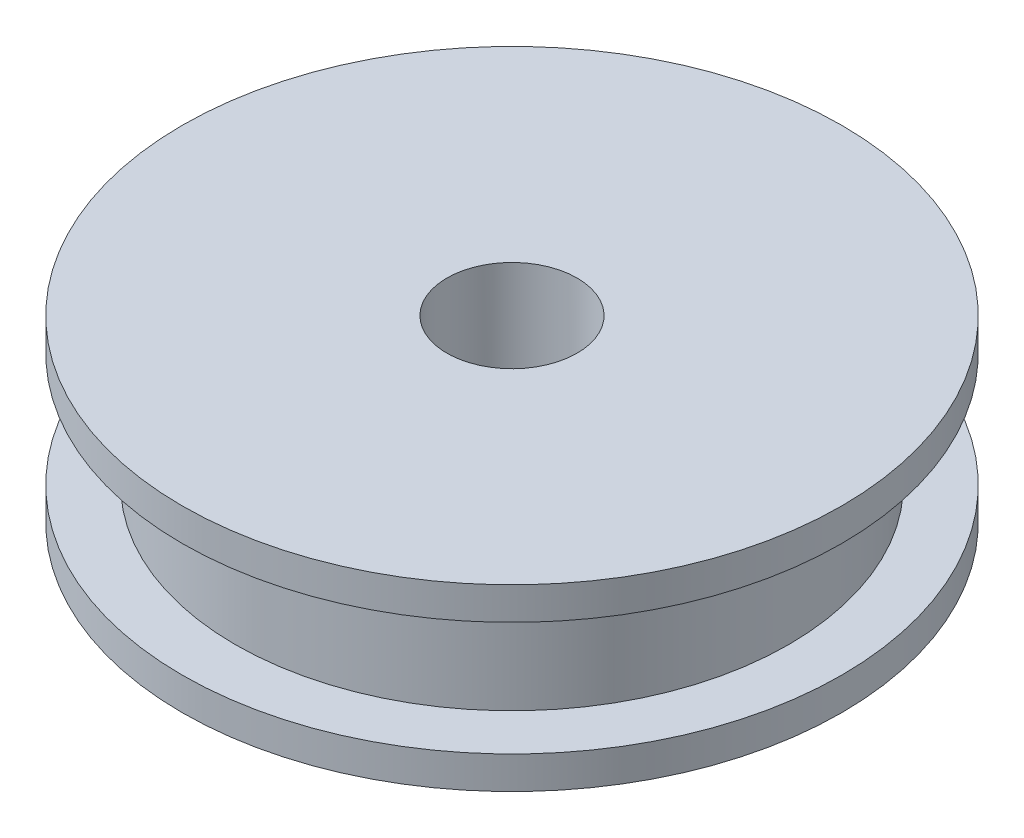
ISO-10303-21;
HEADER;
FILE_DESCRIPTION(('STEP AP214'),'2;1');
FILE_NAME('part.step','',(''),(''),'','','');
FILE_SCHEMA(('AUTOMOTIVE_DESIGN { 1 0 10303 214 1 1 1 1 }'));
ENDSEC;
DATA;
#1=APPLICATION_CONTEXT('core data for automotive mechanical design processes');
#2=APPLICATION_PROTOCOL_DEFINITION('international standard','automotive_design',2000,#1);
#3=PRODUCT_CONTEXT('',#1,'mechanical');
#4=PRODUCT('Part','Part','',(#3));
#5=PRODUCT_RELATED_PRODUCT_CATEGORY('part','',(#4));
#6=PRODUCT_DEFINITION_FORMATION('','',#4);
#7=PRODUCT_DEFINITION_CONTEXT('part definition',#1,'design');
#8=PRODUCT_DEFINITION('design','',#6,#7);
#9=PRODUCT_DEFINITION_SHAPE('','',#8);
#10=(LENGTH_UNIT() NAMED_UNIT(*) SI_UNIT(.MILLI.,.METRE.));
#11=(NAMED_UNIT(*) PLANE_ANGLE_UNIT() SI_UNIT($,.RADIAN.));
#12=(NAMED_UNIT(*) SI_UNIT($,.STERADIAN.) SOLID_ANGLE_UNIT());
#13=UNCERTAINTY_MEASURE_WITH_UNIT(LENGTH_MEASURE(1.E-05),#10,'distance_accuracy_value','');
#14=(GEOMETRIC_REPRESENTATION_CONTEXT(3) GLOBAL_UNCERTAINTY_ASSIGNED_CONTEXT((#13)) GLOBAL_UNIT_ASSIGNED_CONTEXT((#10,
#11,#12)) REPRESENTATION_CONTEXT('',''));
#15=CARTESIAN_POINT('',(0.,0.,0.));
#16=DIRECTION('',(0.,0.,1.));
#17=DIRECTION('',(1.,0.,0.));
#18=AXIS2_PLACEMENT_3D('',#15,#16,#17);
#19=CARTESIAN_POINT('',(-10.,0.,0.));
#20=DIRECTION('',(0.,1.,0.));
#21=DIRECTION('',(0.,0.,1.));
#22=AXIS2_PLACEMENT_3D('',#19,#20,#21);
#23=PLANE('',#22);
#24=CARTESIAN_POINT('',(0.,0.,0.));
#25=DIRECTION('',(0.,-1.,0.));
#26=DIRECTION('',(0.,0.,-1.));
#27=AXIS2_PLACEMENT_3D('',#24,#25,#26);
#28=CIRCLE('',#27,4.);
#29=CARTESIAN_POINT('',(0.,0.,-4.));
#30=VERTEX_POINT('',#29);
#31=EDGE_CURVE('E10',#30,#30,#28,.T.);
#32=ORIENTED_EDGE('',*,*,#31,.F.);
#33=EDGE_LOOP('',(#32));
#34=FACE_BOUND('',#33,.T.);
#35=CARTESIAN_POINT('',(0.,0.,0.));
#36=DIRECTION('',(0.,-1.,0.));
#37=DIRECTION('',(0.,0.,-1.));
#38=AXIS2_PLACEMENT_3D('',#35,#36,#37);
#39=CIRCLE('',#38,10.);
#40=CARTESIAN_POINT('',(0.,0.,-10.));
#41=VERTEX_POINT('',#40);
#42=EDGE_CURVE('E91',#41,#41,#39,.T.);
#43=ORIENTED_EDGE('',*,*,#42,.T.);
#44=EDGE_LOOP('',(#43));
#45=FACE_BOUND('',#44,.T.);
#46=ADVANCED_FACE('F42',(#34,#45),#23,.F.);
#47=CARTESIAN_POINT('',(0.,0.,0.));
#48=DIRECTION('',(0.,-1.,0.));
#49=DIRECTION('',(0.,0.,-1.));
#50=AXIS2_PLACEMENT_3D('',#47,#48,#49);
#51=CYLINDRICAL_SURFACE('',#50,4.);
#52=CARTESIAN_POINT('',(-3.46410161513776,3.5,-1.99999999999999));
#53=CARTESIAN_POINT('',(-3.46411185715888,3.39578679452565,-1.9999915874878));
#54=CARTESIAN_POINT('',(-3.46887633544978,3.2914378234662,-1.99179963610436));
#55=CARTESIAN_POINT('',(-3.48724701669073,3.0859448227694,-1.95944672580052));
#56=CARTESIAN_POINT('',(-3.50087179788183,2.98480799675224,-1.93525221095661));
#57=CARTESIAN_POINT('',(-3.53498701490002,2.78909684355306,-1.87219981598029));
#58=CARTESIAN_POINT('',(-3.55544089069169,2.69449074115075,-1.83341988295962));
#59=CARTESIAN_POINT('',(-3.60085327291133,2.51315154952384,-1.74253507245137));
#60=CARTESIAN_POINT('',(-3.62581202301254,2.42641888656322,-1.69042947410138));
#61=CARTESIAN_POINT('',(-3.67993738819289,2.25538855686661,-1.56933307453799));
#62=CARTESIAN_POINT('',(-3.70928127465104,2.17188173240823,-1.49930407053532));
#63=CARTESIAN_POINT('',(-3.76743965382122,2.0171832194294,-1.346507616982));
#64=CARTESIAN_POINT('',(-3.79625387610259,1.94599767379603,-1.2637338520484));
#65=CARTESIAN_POINT('',(-3.85242953961661,1.8132656988115,-1.08097912631264));
#66=CARTESIAN_POINT('',(-3.87956212851245,1.75269246457669,-0.98021437788714));
#67=CARTESIAN_POINT('',(-3.92701512184167,1.64971829321291,-0.768314053336903));
#68=CARTESIAN_POINT('',(-3.94733982363631,1.6073058876492,-0.657185076311971));
#69=CARTESIAN_POINT('',(-3.97760922492053,1.54499067746882,-0.436089887818803));
#70=CARTESIAN_POINT('',(-3.9881896044274,1.5237009473079,-0.326603580968771));
#71=CARTESIAN_POINT('',(-4.00015167691179,1.49966776263097,-0.105141257404526));
#72=CARTESIAN_POINT('',(-4.00153893568935,1.49691308640371,0.00683321168522141));
#73=CARTESIAN_POINT('',(-3.99525963833124,1.50949334794514,0.219665048849586));
#74=CARTESIAN_POINT('',(-3.98836991784381,1.52327603104363,0.320642398354152));
#75=CARTESIAN_POINT('',(-3.96748490519435,1.56576168780812,0.518627543836102));
#76=CARTESIAN_POINT('',(-3.95348908132771,1.59446577795212,0.615635042187715));
#77=CARTESIAN_POINT('',(-3.91943166575325,1.66616513217995,0.804618783139273));
#78=CARTESIAN_POINT('',(-3.89928883058402,1.70935262634422,0.896506847030411));
#79=CARTESIAN_POINT('',(-3.8547529197337,1.8085268324029,1.07195360302663));
#80=CARTESIAN_POINT('',(-3.83035832314967,1.86451812660467,1.15550929767729));
#81=CARTESIAN_POINT('',(-3.77688788798459,1.99379070306606,1.32034732179642));
#82=CARTESIAN_POINT('',(-3.7475875199635,2.06820605665203,1.40066815005874));
#83=CARTESIAN_POINT('',(-3.68908681173622,2.22917944986034,1.54820874059557));
#84=CARTESIAN_POINT('',(-3.65988656531257,2.31574674454812,1.61541842314847));
#85=CARTESIAN_POINT('',(-3.60288312184969,2.50529638484818,1.73901066928444));
#86=CARTESIAN_POINT('',(-3.57528639981415,2.60897204610842,1.79443462995612));
#87=CARTESIAN_POINT('',(-3.52750900557151,2.82587534271799,1.88663822600248));
#88=CARTESIAN_POINT('',(-3.50732060092134,2.93909286603512,1.92343731642179));
#89=CARTESIAN_POINT('',(-3.47889271634068,3.16242902256558,1.97436042205009));
#90=CARTESIAN_POINT('',(-3.46983311696992,3.2720822380871,1.99005024423996));
#91=CARTESIAN_POINT('',(-3.46235838723218,3.49280268303309,2.00303389322287));
#92=CARTESIAN_POINT('',(-3.46393573778623,3.60386885823959,2.00034071463007));
#93=CARTESIAN_POINT('',(-3.47668673081169,3.81130783715744,1.97807208668794));
#94=CARTESIAN_POINT('',(-3.48679175013307,3.90795890221578,1.96037563342494));
#95=CARTESIAN_POINT('',(-3.51388043102682,4.09673557254199,1.9113925692649));
#96=CARTESIAN_POINT('',(-3.53086632010067,4.18885970149348,1.88010155724728));
#97=CARTESIAN_POINT('',(-3.57072444159312,4.37082266180511,1.80329517720974));
#98=CARTESIAN_POINT('',(-3.59383286486125,4.46035803370605,1.75718812738531));
#99=CARTESIAN_POINT('',(-3.64312238994499,4.63093854307904,1.65257412803177));
#100=CARTESIAN_POINT('',(-3.66930506710297,4.71197928703051,1.594060808665));
#101=CARTESIAN_POINT('',(-3.72575996912668,4.87395753504266,1.4576743343971));
#102=CARTESIAN_POINT('',(-3.75613166308566,4.95359430141778,1.37829054462749));
#103=CARTESIAN_POINT('',(-3.81468469955797,5.09882447600473,1.20680899079905));
#104=CARTESIAN_POINT('',(-3.84286530015463,5.16441314052684,1.11470694931992));
#105=CARTESIAN_POINT('',(-3.89482723381867,5.28114745183271,0.917070725108071));
#106=CARTESIAN_POINT('',(-3.91847283343884,5.33186623616677,0.811246195112507));
#107=CARTESIAN_POINT('',(-3.95766709918776,5.41427580796961,0.591044729317877));
#108=CARTESIAN_POINT('',(-3.97322287353397,5.4459833036841,0.476675402917665));
#109=CARTESIAN_POINT('',(-3.99335016363174,5.48673712748514,0.253959364539777));
#110=CARTESIAN_POINT('',(-3.9987985581427,5.49759574866427,0.146022887268314));
#111=CARTESIAN_POINT('',(-4.00084260752374,5.50168653399567,-0.0702519714699317));
#112=CARTESIAN_POINT('',(-3.99744136141634,5.49492486852886,-0.1785901989816));
#113=CARTESIAN_POINT('',(-3.98267937668509,5.46516717568359,-0.385075986136846));
#114=CARTESIAN_POINT('',(-3.97185789309443,5.44327026269095,-0.483424641057406));
#115=CARTESIAN_POINT('',(-3.94384187353388,5.38534604019333,-0.674891898931552));
#116=CARTESIAN_POINT('',(-3.92664642364424,5.34931670429308,-0.768009749669759));
#117=CARTESIAN_POINT('',(-3.88651861393181,5.26254574500859,-0.950846833596728));
#118=CARTESIAN_POINT('',(-3.86337234005404,5.21124078024814,-1.04025036572289));
#119=CARTESIAN_POINT('',(-3.81376266676027,5.0960847118819,-1.20954920326827));
#120=CARTESIAN_POINT('',(-3.78729774583428,5.03222784589843,-1.28944011444317));
#121=CARTESIAN_POINT('',(-3.73057218840582,4.88640336444058,-1.44582833859494));
#122=CARTESIAN_POINT('',(-3.70019591726076,4.80326581919971,-1.52119665879198));
#123=CARTESIAN_POINT('',(-3.64126158628572,4.62510777169391,-1.65732528394005));
#124=CARTESIAN_POINT('',(-3.61270515130785,4.53007686863948,-1.71807266521242));
#125=CARTESIAN_POINT('',(-3.55999186256752,4.32669110586975,-1.82486714716809));
#126=CARTESIAN_POINT('',(-3.53600256268536,4.21801008926472,-1.87038902381912));
#127=CARTESIAN_POINT('',(-3.50696218132371,4.04942188036905,-1.92395929504799));
#128=CARTESIAN_POINT('',(-3.49844389329402,3.99235217940932,-1.93935666147966));
#129=CARTESIAN_POINT('',(-3.48406059323536,3.87676744249981,-1.96508069805042));
#130=CARTESIAN_POINT('',(-3.47819372636051,3.81825344724575,-1.97541091343281));
#131=CARTESIAN_POINT('',(-3.47059023668758,3.71639921075271,-1.98872932961219));
#132=CARTESIAN_POINT('',(-3.46816389731816,3.67326694274992,-1.99295091983785));
#133=CARTESIAN_POINT('',(-3.46491740045178,3.5867643069071,-1.99858810035605));
#134=CARTESIAN_POINT('',(-3.46409735040493,3.5433939233333,-2.0000035029333));
#135=CARTESIAN_POINT('',(-3.46410161513776,3.5,-1.99999999999999));
#136=B_SPLINE_CURVE_WITH_KNOTS('',3,(#52,#53,#54,#55,#56,#57,#58,#59,#60,#61,#62,#63,#64,#65,
#66,#67,#68,#69,#70,#71,#72,#73,#74,#75,#76,#77,#78,#79,#80,#81,#82,#83,#84,#85,#86,#87,#88,#89,
#90,#91,#92,#93,#94,#95,#96,#97,#98,#99,#100,#101,#102,#103,#104,#105,#106,#107,#108,#109,#110,
#111,#112,#113,#114,#115,#116,#117,#118,#119,#120,#121,#122,#123,#124,#125,#126,#127,#128,#129,
#130,#131,#132,#133,#134,#135),.UNSPECIFIED.,.T.,.F.,(4,2,2,2,2,2,2,2,2,2,2,2,2,2,2,2,2,2,2,2,2,
2,2,2,2,2,2,2,2,2,2,2,2,2,2,2,2,2,2,2,2,4),(0.,0.312464245189431,0.62558578564961,
0.937057191861536,1.24854545093097,1.58572462503713,1.92307142172809,2.28315784481594,
2.64301653931849,2.97726969939937,3.31132047376147,3.61632194973143,3.92134625038977,
4.2305906946636,4.5399459870461,4.87854382917848,5.21740096495904,5.57777683462963,
5.93777548427476,6.2692458171249,6.60048186380813,6.89548366852118,7.19058104876193,
7.49934592816242,7.80826972444161,8.15613487165293,8.50411729960471,8.86128362829998,
9.2181355962161,9.5422454078304,9.8662417359201,10.1688884974705,10.4715786702809,
10.7872150144301,11.102996602055,11.450204837042,11.7977188569437,12.1562149808128,
12.3351395323571,12.5139387197526,12.6440387634036,12.7741475095882),.UNSPECIFIED.);
#137=CARTESIAN_POINT('',(-3.46410161513776,3.5,-1.99999999999999));
#138=VERTEX_POINT('',#137);
#139=EDGE_CURVE('E72',#138,#138,#136,.T.);
#140=ORIENTED_EDGE('',*,*,#139,.T.);
#141=EDGE_LOOP('',(#140));
#142=FACE_BOUND('',#141,.T.);
#143=CARTESIAN_POINT('',(0.,5.5,-4.));
#144=CARTESIAN_POINT('',(0.105143925902467,5.49999339536561,-3.99999426810082));
#145=CARTESIAN_POINT('',(0.210413199395125,5.49165985375789,-3.99580982039513));
#146=CARTESIAN_POINT('',(0.417840470537792,5.45869423931692,-3.97948312074314));
#147=CARTESIAN_POINT('',(0.519992173427259,5.43403121400437,-3.96732575657839));
#148=CARTESIAN_POINT('',(0.717867089760898,5.36961238276674,-3.93632558806751));
#149=CARTESIAN_POINT('',(0.813613605878292,5.32991523150406,-3.91750878355075));
#150=CARTESIAN_POINT('',(0.996945233613197,5.23685875727003,-3.87491553031523));
#151=CARTESIAN_POINT('',(1.08453098798012,5.18350051150227,-3.85113947267051));
#152=CARTESIAN_POINT('',(1.25501563552382,5.06096550102943,-3.79912516516124));
#153=CARTESIAN_POINT('',(1.33731042224422,4.99102704152072,-3.77070398255074));
#154=CARTESIAN_POINT('',(1.48955888973396,4.83895704150592,-3.71319940493486));
#155=CARTESIAN_POINT('',(1.55950316621353,4.75681629645512,-3.68411552418069));
#156=CARTESIAN_POINT('',(1.69050400090056,4.57503330095324,-3.62597902394695));
#157=CARTESIAN_POINT('',(1.75045067110327,4.47452780330817,-3.59710373940264));
#158=CARTESIAN_POINT('',(1.85233645378139,4.26326532802757,-3.54571957544641));
#159=CARTESIAN_POINT('',(1.89428842993267,4.1525157425545,-3.52320615213979));
#160=CARTESIAN_POINT('',(1.95626488437718,3.93066978915615,-3.48915734075617));
#161=CARTESIAN_POINT('',(1.97745171416088,3.81999109586521,-3.47704543167427));
#162=CARTESIAN_POINT('',(2.00085398661769,3.59604232444104,-3.46363779897055));
#163=CARTESIAN_POINT('',(2.00308817674615,3.48277491825769,-3.46233138686576));
#164=CARTESIAN_POINT('',(1.98937457434459,3.27142795136926,-3.47021860514497));
#165=CARTESIAN_POINT('',(1.97556911907364,3.1731519375539,-3.47817527324027));
#166=CARTESIAN_POINT('',(1.93387969811386,2.98055618125391,-3.50152457467701));
#167=CARTESIAN_POINT('',(1.9059912477953,2.88623770938937,-3.51691957663553));
#168=CARTESIAN_POINT('',(1.83641956077201,2.70154173486868,-3.55374952825482));
#169=CARTESIAN_POINT('',(1.79443013423199,2.61130720242842,-3.57531681327997));
#170=CARTESIAN_POINT('',(1.698083375336,2.43873141481998,-3.62206808562807));
#171=CARTESIAN_POINT('',(1.64372048762493,2.35639372879982,-3.64725369560381));
#172=CARTESIAN_POINT('',(1.51613210982558,2.19095749451354,-3.70226315806572));
#173=CARTESIAN_POINT('',(1.44138891673856,2.10908625284768,-3.73227020473492));
#174=CARTESIAN_POINT('',(1.27911115748275,1.95852916281819,-3.79095246600814));
#175=CARTESIAN_POINT('',(1.19157051314857,1.88984961593223,-3.81962703917602));
#176=CARTESIAN_POINT('',(1.0010330116637,1.76462867794054,-3.87403974565928));
#177=CARTESIAN_POINT('',(0.897507183198817,1.70879905510852,-3.89957968324015));
#178=CARTESIAN_POINT('',(0.680932430977592,1.61580594191398,-3.94315762242485));
#179=CARTESIAN_POINT('',(0.567891152530551,1.57862762996966,-3.96120157887106));
#180=CARTESIAN_POINT('',(0.345532983321404,1.52704919256664,-3.98648667482871));
#181=CARTESIAN_POINT('',(0.236683061096652,1.51101752850644,-3.9944987660262));
#182=CARTESIAN_POINT('',(0.017559199898703,1.49707053773102,-4.00146026918207));
#183=CARTESIAN_POINT('',(-0.0927140397398178,1.49914662872106,-4.00041397442637));
#184=CARTESIAN_POINT('',(-0.302465943971974,1.52041337683749,-3.9898238450687));
#185=CARTESIAN_POINT('',(-0.402118816099861,1.53826506545999,-3.98094491376337));
#186=CARTESIAN_POINT('',(-0.596813784603883,1.58847614379024,-3.9564434262968));
#187=CARTESIAN_POINT('',(-0.691855371382175,1.62083713290699,-3.94082012668824));
#188=CARTESIAN_POINT('',(-0.877777216899146,1.69999693286606,-3.90368502827176));
#189=CARTESIAN_POINT('',(-0.968460794011607,1.74718210023257,-3.88201763539261));
#190=CARTESIAN_POINT('',(-1.14092272339854,1.85421507129313,-3.83487948634835));
#191=CARTESIAN_POINT('',(-1.22269725955318,1.91406826919079,-3.80940711133877));
#192=CARTESIAN_POINT('',(-1.38353537857843,2.05152085066143,-3.75416442672396));
#193=CARTESIAN_POINT('',(-1.46154415563805,2.13028573689029,-3.72421769686998));
#194=CARTESIAN_POINT('',(-1.60371264223771,2.29985030255545,-3.6652478321764));
#195=CARTESIAN_POINT('',(-1.66786277142375,2.39065823769584,-3.63622534800094));
#196=CARTESIAN_POINT('',(-1.78341582895804,2.58728730834595,-3.58102384412979));
#197=CARTESIAN_POINT('',(-1.8340509916005,2.69362253218896,-3.55505059178121));
#198=CARTESIAN_POINT('',(-1.91616565186941,2.91502013514993,-3.51148144588269));
#199=CARTESIAN_POINT('',(-1.94766983173403,3.03007105293378,-3.493874764435));
#200=CARTESIAN_POINT('',(-1.98772337493374,3.25382044576941,-3.47123002051604));
#201=CARTESIAN_POINT('',(-1.9981859928109,3.36206850687048,-3.4651476693013));
#202=CARTESIAN_POINT('',(-2.0013783087524,3.57889413432905,-3.46330709283206));
#203=CARTESIAN_POINT('',(-1.99411569324648,3.68747153747572,-3.4675443925278));
#204=CARTESIAN_POINT('',(-1.96385225118662,3.89096700306687,-3.48475724102153));
#205=CARTESIAN_POINT('',(-1.94241662868607,3.98620094028948,-3.49686188965317));
#206=CARTESIAN_POINT('',(-1.88635071644882,4.17161623884873,-3.52742032375305));
#207=CARTESIAN_POINT('',(-1.85171618231984,4.26179596418406,-3.54587615139337));
#208=CARTESIAN_POINT('',(-1.76763149060113,4.44124970197307,-3.58857060729071));
#209=CARTESIAN_POINT('',(-1.7173422756314,4.53005580365806,-3.61311444791841));
#210=CARTESIAN_POINT('',(-1.60430194327478,4.69854907236252,-3.66470663269721));
#211=CARTESIAN_POINT('',(-1.54154434248312,4.77823146104222,-3.69175627591221));
#212=CARTESIAN_POINT('',(-1.39640665332275,4.93628396470935,-3.74924646316184));
#213=CARTESIAN_POINT('',(-1.31256884599452,5.01331820470058,-3.77969966613256));
#214=CARTESIAN_POINT('',(-1.13230961246639,5.15252596687054,-3.83755504519861));
#215=CARTESIAN_POINT('',(-1.03588144661039,5.21469147893981,-3.8649555725239));
#216=CARTESIAN_POINT('',(-0.83186319356589,5.32247272542414,-3.91396019133075));
#217=CARTESIAN_POINT('',(-0.72419900755346,5.36796833847293,-3.93552192987866));
#218=CARTESIAN_POINT('',(-0.501484202276172,5.43961633551482,-3.97002682597974));
#219=CARTESIAN_POINT('',(-0.386455599178198,5.46582369361142,-3.98299446726136));
#220=CARTESIAN_POINT('',(-0.225203892981789,5.48779482217148,-3.99390923826956));
#221=CARTESIAN_POINT('',(-0.180323758883129,5.49236528173268,-3.99618730680502));
#222=CARTESIAN_POINT('',(-0.0903034636101832,5.49846933102817,-3.99923393953631));
#223=CARTESIAN_POINT('',(-0.0451632952932569,5.50000283694042,-4.00000246206762));
#224=CARTESIAN_POINT('',(0.,5.5,-4.));
#225=B_SPLINE_CURVE_WITH_KNOTS('',3,(#143,#144,#145,#146,#147,#148,#149,#150,#151,#152,#153,
#154,#155,#156,#157,#158,#159,#160,#161,#162,#163,#164,#165,#166,#167,#168,#169,#170,#171,#172,
#173,#174,#175,#176,#177,#178,#179,#180,#181,#182,#183,#184,#185,#186,#187,#188,#189,#190,#191,
#192,#193,#194,#195,#196,#197,#198,#199,#200,#201,#202,#203,#204,#205,#206,#207,#208,#209,#210,
#211,#212,#213,#214,#215,#216,#217,#218,#219,#220,#221,#222,#223,#224),.UNSPECIFIED.,.T.,.F.,(4,
2,2,2,2,2,2,2,2,2,2,2,2,2,2,2,2,2,2,2,2,2,2,2,2,2,2,2,2,2,2,2,2,2,2,2,2,2,2,2,4),(0.,
0.315248514840585,0.631096299418396,0.945724310984597,1.26032752116314,1.59396351743618,
1.92785247530807,2.28763452861506,2.64715895796562,2.98516024280459,3.32282714658041,
3.62011424818641,3.91749607851357,4.22180480336975,4.52625042520444,4.86929882667757,
5.21251069197373,5.57166044428881,5.93052433824559,6.25966580942691,6.58865129022952,
6.89213813012244,7.19565843261863,7.50785712055797,7.82018901496679,8.16319221288838,
8.50643177230864,8.86629364323452,9.22569023890902,9.55058615006093,9.87534119729357,
10.1691586049771,10.463070575767,10.7767291356057,11.0905512228726,11.4425048551434,
11.7946476676249,12.1492802732705,12.502898172423,12.6383056026783,12.7737167702213),.UNSPECIFIED.);
#226=CARTESIAN_POINT('',(0.,5.5,-4.));
#227=VERTEX_POINT('',#226);
#228=EDGE_CURVE('E71',#227,#227,#225,.T.);
#229=ORIENTED_EDGE('',*,*,#228,.T.);
#230=EDGE_LOOP('',(#229));
#231=FACE_BOUND('',#230,.T.);
#232=CARTESIAN_POINT('',(0.,18.,0.));
#233=DIRECTION('',(0.,-1.,0.));
#234=DIRECTION('',(0.,0.,-1.));
#235=AXIS2_PLACEMENT_3D('',#232,#233,#234);
#236=CIRCLE('',#235,4.);
#237=CARTESIAN_POINT('',(0.,18.,-4.));
#238=VERTEX_POINT('',#237);
#239=EDGE_CURVE('E55',#238,#238,#236,.T.);
#240=ORIENTED_EDGE('',*,*,#239,.F.);
#241=EDGE_LOOP('',(#240));
#242=FACE_BOUND('',#241,.T.);
#243=ORIENTED_EDGE('',*,*,#31,.T.);
#244=EDGE_LOOP('',(#243));
#245=FACE_BOUND('',#244,.T.);
#246=ADVANCED_FACE('F96',(#142,#231,#242,#245),#51,.F.);
#247=CARTESIAN_POINT('',(-4.,18.,0.));
#248=DIRECTION('',(0.,-1.,0.));
#249=DIRECTION('',(0.,0.,-1.));
#250=AXIS2_PLACEMENT_3D('',#247,#248,#249);
#251=PLANE('',#250);
#252=CARTESIAN_POINT('',(0.,18.,0.));
#253=DIRECTION('',(0.,-1.,0.));
#254=DIRECTION('',(0.,0.,-1.));
#255=AXIS2_PLACEMENT_3D('',#252,#253,#254);
#256=CIRCLE('',#255,20.25);
#257=CARTESIAN_POINT('',(0.,18.,-20.25));
#258=VERTEX_POINT('',#257);
#259=EDGE_CURVE('E61',#258,#258,#256,.T.);
#260=ORIENTED_EDGE('',*,*,#259,.F.);
#261=EDGE_LOOP('',(#260));
#262=FACE_BOUND('',#261,.T.);
#263=ORIENTED_EDGE('',*,*,#239,.T.);
#264=EDGE_LOOP('',(#263));
#265=FACE_BOUND('',#264,.T.);
#266=ADVANCED_FACE('F100',(#262,#265),#251,.F.);
#267=CARTESIAN_POINT('',(0.,0.,0.));
#268=DIRECTION('',(0.,-1.,0.));
#269=DIRECTION('',(0.,0.,-1.));
#270=AXIS2_PLACEMENT_3D('',#267,#268,#269);
#271=CYLINDRICAL_SURFACE('',#270,20.25);
#272=CARTESIAN_POINT('',(0.,16.,0.));
#273=DIRECTION('',(0.,-1.,0.));
#274=DIRECTION('',(0.,0.,-1.));
#275=AXIS2_PLACEMENT_3D('',#272,#273,#274);
#276=CIRCLE('',#275,20.25);
#277=CARTESIAN_POINT('',(0.,16.,-20.25));
#278=VERTEX_POINT('',#277);
#279=EDGE_CURVE('E166',#278,#278,#276,.T.);
#280=ORIENTED_EDGE('',*,*,#279,.F.);
#281=EDGE_LOOP('',(#280));
#282=FACE_BOUND('',#281,.T.);
#283=ORIENTED_EDGE('',*,*,#259,.T.);
#284=EDGE_LOOP('',(#283));
#285=FACE_BOUND('',#284,.T.);
#286=ADVANCED_FACE('F105',(#282,#285),#271,.T.);
#287=CARTESIAN_POINT('',(-20.25,16.,0.));
#288=DIRECTION('',(0.,1.,0.));
#289=DIRECTION('',(0.,0.,1.));
#290=AXIS2_PLACEMENT_3D('',#287,#288,#289);
#291=PLANE('',#290);
#292=CARTESIAN_POINT('',(0.,16.,0.));
#293=DIRECTION('',(0.,-1.,0.));
#294=DIRECTION('',(0.,0.,-1.));
#295=AXIS2_PLACEMENT_3D('',#292,#293,#294);
#296=CIRCLE('',#295,17.);
#297=CARTESIAN_POINT('',(0.,16.,-17.));
#298=VERTEX_POINT('',#297);
#299=EDGE_CURVE('E162',#298,#298,#296,.T.);
#300=ORIENTED_EDGE('',*,*,#299,.F.);
#301=EDGE_LOOP('',(#300));
#302=FACE_BOUND('',#301,.T.);
#303=ORIENTED_EDGE('',*,*,#279,.T.);
#304=EDGE_LOOP('',(#303));
#305=FACE_BOUND('',#304,.T.);
#306=ADVANCED_FACE('F109',(#302,#305),#291,.F.);
#307=CARTESIAN_POINT('',(0.,0.,0.));
#308=DIRECTION('',(0.,-1.,0.));
#309=DIRECTION('',(0.,0.,-1.));
#310=AXIS2_PLACEMENT_3D('',#307,#308,#309);
#311=CYLINDRICAL_SURFACE('',#310,17.);
#312=CARTESIAN_POINT('',(0.,9.,0.));
#313=DIRECTION('',(0.,-1.,0.));
#314=DIRECTION('',(0.,0.,-1.));
#315=AXIS2_PLACEMENT_3D('',#312,#313,#314);
#316=CIRCLE('',#315,17.);
#317=CARTESIAN_POINT('',(0.,9.,-17.));
#318=VERTEX_POINT('',#317);
#319=EDGE_CURVE('E158',#318,#318,#316,.T.);
#320=ORIENTED_EDGE('',*,*,#319,.F.);
#321=EDGE_LOOP('',(#320));
#322=FACE_BOUND('',#321,.T.);
#323=ORIENTED_EDGE('',*,*,#299,.T.);
#324=EDGE_LOOP('',(#323));
#325=FACE_BOUND('',#324,.T.);
#326=ADVANCED_FACE('F113',(#322,#325),#311,.T.);
#327=CARTESIAN_POINT('',(-17.,8.99999999999999,0.));
#328=DIRECTION('',(0.,-1.,0.));
#329=DIRECTION('',(0.,0.,-1.));
#330=AXIS2_PLACEMENT_3D('',#327,#328,#329);
#331=PLANE('',#330);
#332=CARTESIAN_POINT('',(0.,8.99999999999999,0.));
#333=DIRECTION('',(0.,-1.,0.));
#334=DIRECTION('',(0.,0.,-1.));
#335=AXIS2_PLACEMENT_3D('',#332,#333,#334);
#336=CIRCLE('',#335,20.25);
#337=CARTESIAN_POINT('',(0.,8.99999999999999,-20.25));
#338=VERTEX_POINT('',#337);
#339=EDGE_CURVE('E152',#338,#338,#336,.T.);
#340=ORIENTED_EDGE('',*,*,#339,.F.);
#341=EDGE_LOOP('',(#340));
#342=FACE_BOUND('',#341,.T.);
#343=ORIENTED_EDGE('',*,*,#319,.T.);
#344=EDGE_LOOP('',(#343));
#345=FACE_BOUND('',#344,.T.);
#346=ADVANCED_FACE('F117',(#342,#345),#331,.F.);
#347=CARTESIAN_POINT('',(0.,0.,0.));
#348=DIRECTION('',(0.,-1.,0.));
#349=DIRECTION('',(0.,0.,-1.));
#350=AXIS2_PLACEMENT_3D('',#347,#348,#349);
#351=CYLINDRICAL_SURFACE('',#350,20.25);
#352=CARTESIAN_POINT('',(0.,6.99999999999999,0.));
#353=DIRECTION('',(0.,-1.,0.));
#354=DIRECTION('',(0.,0.,-1.));
#355=AXIS2_PLACEMENT_3D('',#352,#353,#354);
#356=CIRCLE('',#355,20.25);
#357=CARTESIAN_POINT('',(0.,6.99999999999999,-20.25));
#358=VERTEX_POINT('',#357);
#359=EDGE_CURVE('E148',#358,#358,#356,.T.);
#360=ORIENTED_EDGE('',*,*,#359,.F.);
#361=EDGE_LOOP('',(#360));
#362=FACE_BOUND('',#361,.T.);
#363=ORIENTED_EDGE('',*,*,#339,.T.);
#364=EDGE_LOOP('',(#363));
#365=FACE_BOUND('',#364,.T.);
#366=ADVANCED_FACE('F121',(#362,#365),#351,.T.);
#367=CARTESIAN_POINT('',(-20.25,7.,0.));
#368=DIRECTION('',(0.,1.,0.));
#369=DIRECTION('',(0.,0.,1.));
#370=AXIS2_PLACEMENT_3D('',#367,#368,#369);
#371=PLANE('',#370);
#372=CARTESIAN_POINT('',(0.,7.,0.));
#373=DIRECTION('',(0.,-1.,0.));
#374=DIRECTION('',(0.,0.,-1.));
#375=AXIS2_PLACEMENT_3D('',#372,#373,#374);
#376=CIRCLE('',#375,10.);
#377=CARTESIAN_POINT('',(0.,7.,-10.));
#378=VERTEX_POINT('',#377);
#379=EDGE_CURVE('E145',#378,#378,#376,.T.);
#380=ORIENTED_EDGE('',*,*,#379,.F.);
#381=EDGE_LOOP('',(#380));
#382=FACE_BOUND('',#381,.T.);
#383=ORIENTED_EDGE('',*,*,#359,.T.);
#384=EDGE_LOOP('',(#383));
#385=FACE_BOUND('',#384,.T.);
#386=ADVANCED_FACE('F124',(#382,#385),#371,.F.);
#387=CARTESIAN_POINT('',(0.,0.,0.));
#388=DIRECTION('',(0.,-1.,0.));
#389=DIRECTION('',(0.,0.,-1.));
#390=AXIS2_PLACEMENT_3D('',#387,#388,#389);
#391=CYLINDRICAL_SURFACE('',#390,10.);
#392=CARTESIAN_POINT('',(-9.79795897113272,3.5,-1.99999999999997));
#393=CARTESIAN_POINT('',(-9.79796118053294,3.61112875098231,-1.99999589175051));
#394=CARTESIAN_POINT('',(-9.79987016537405,3.72230924666668,-1.99070634343626));
#395=CARTESIAN_POINT('',(-9.8072886260975,3.94152501028626,-1.95382456716565));
#396=CARTESIAN_POINT('',(-9.81280098289575,4.04955768927196,-1.92621769414095));
#397=CARTESIAN_POINT('',(-9.8267774744371,4.25927460670842,-1.85359156523946));
#398=CARTESIAN_POINT('',(-9.83523867242151,4.36096504306518,-1.80858962830521));
#399=CARTESIAN_POINT('',(-9.85415598961318,4.55534968939391,-1.70249821534098));
#400=CARTESIAN_POINT('',(-9.86461199746923,4.6480444010758,-1.64140963720227));
#401=CARTESIAN_POINT('',(-9.88650599388506,4.82312200770772,-1.50395815130684));
#402=CARTESIAN_POINT('',(-9.89795475674493,4.90535917576794,-1.4274113118266));
#403=CARTESIAN_POINT('',(-9.92044944605197,5.05591506715796,-1.26161357804259));
#404=CARTESIAN_POINT('',(-9.93149534421664,5.12423281483438,-1.17236179395593));
#405=CARTESIAN_POINT('',(-9.95205592835125,5.24557603525692,-0.982722711848477));
#406=CARTESIAN_POINT('',(-9.96155642883102,5.29846302763328,-0.882245135344386));
#407=CARTESIAN_POINT('',(-9.97783473767263,5.38654987409627,-0.673608300774509));
#408=CARTESIAN_POINT('',(-9.98461280088239,5.42175138380198,-0.565449762841072));
#409=CARTESIAN_POINT('',(-9.99460641376837,5.47301438723925,-0.346033546556955));
#410=CARTESIAN_POINT('',(-9.99786772576254,5.48932195514201,-0.234835478429594));
#411=CARTESIAN_POINT('',(-10.0006184236721,5.50310190367663,-0.0112371368750388));
#412=CARTESIAN_POINT('',(-10.0001081730552,5.50057609929164,0.10116301966372));
#413=CARTESIAN_POINT('',(-9.99540869737031,5.47694763956889,0.322284001487211));
#414=CARTESIAN_POINT('',(-9.99127196731677,5.4561100456643,0.431034428596974));
#415=CARTESIAN_POINT('',(-9.97984354318817,5.39686993508221,0.643463253160636));
#416=CARTESIAN_POINT('',(-9.97255172288078,5.35846671561625,0.747141447494292));
#417=CARTESIAN_POINT('',(-9.95554592039917,5.26493991970546,0.947238926401808));
#418=CARTESIAN_POINT('',(-9.94581696350447,5.20971249779022,1.04360834826783));
#419=CARTESIAN_POINT('',(-9.92500938947571,5.0841818455268,1.22581009171955));
#420=CARTESIAN_POINT('',(-9.91393061710444,5.01387688045897,1.31164119905004));
#421=CARTESIAN_POINT('',(-9.89141928728919,4.85873275578305,1.47190286210695));
#422=CARTESIAN_POINT('',(-9.87998392915032,4.77366162654082,1.5461086331473));
#423=CARTESIAN_POINT('',(-9.85823143197521,4.59216711509849,1.67923698635365));
#424=CARTESIAN_POINT('',(-9.84791431409096,4.49574351823361,1.73815927945554));
#425=CARTESIAN_POINT('',(-9.82956094945847,4.29395833635639,1.8391256296038));
#426=CARTESIAN_POINT('',(-9.82152963127098,4.18857806472067,1.88113329555545));
#427=CARTESIAN_POINT('',(-9.80872952642545,3.97205735255202,1.9467806832552));
#428=CARTESIAN_POINT('',(-9.80396031456855,3.86091766476183,1.97042279891332));
#429=CARTESIAN_POINT('',(-9.79830958535655,3.63807028400191,1.99833201207214));
#430=CARTESIAN_POINT('',(-9.79736294114308,3.52640485137932,2.00292371779586));
#431=CARTESIAN_POINT('',(-9.79928971377707,3.30390355360063,1.99347525662151));
#432=CARTESIAN_POINT('',(-9.80216291400775,3.19306764176227,1.97943614624492));
#433=CARTESIAN_POINT('',(-9.81134464989829,2.97646271941553,1.93340441614835));
#434=CARTESIAN_POINT('',(-9.81761998028993,2.87065531392847,1.90158524167863));
#435=CARTESIAN_POINT('',(-9.83286978703329,2.66587344194252,1.82108207061707));
#436=CARTESIAN_POINT('',(-9.84184448572539,2.56689953912856,1.77239668474639));
#437=CARTESIAN_POINT('',(-9.86162811924078,2.37717378009968,1.65880828443123));
#438=CARTESIAN_POINT('',(-9.87245943729806,2.28654590739834,1.59370215596554));
#439=CARTESIAN_POINT('',(-9.89467447653273,2.11738337599817,1.44939114442546));
#440=CARTESIAN_POINT('',(-9.90605825447636,2.03884996350149,1.37018481028911));
#441=CARTESIAN_POINT('',(-9.92830691738431,1.89487488162884,1.19846454699582));
#442=CARTESIAN_POINT('',(-9.93916115417367,1.82965269070001,1.10576499785929));
#443=CARTESIAN_POINT('',(-9.9589425525724,1.71570823700083,0.910535793269546));
#444=CARTESIAN_POINT('',(-9.96786979510422,1.66698528131043,0.808006550867048));
#445=CARTESIAN_POINT('',(-9.98274588122133,1.58774225650673,0.59660536164806));
#446=CARTESIAN_POINT('',(-9.98871158285205,1.55711896354749,0.487773346956191));
#447=CARTESIAN_POINT('',(-9.99706471875323,1.51461750467231,0.266378909359858));
#448=CARTESIAN_POINT('',(-9.99945258399698,1.50273708104864,0.153816937422458));
#449=CARTESIAN_POINT('',(-10.0003708090823,1.49814603807422,-0.0697457878072078));
#450=CARTESIAN_POINT('',(-9.99896757098659,1.50510543908754,-0.180739624282954));
#451=CARTESIAN_POINT('',(-9.99260087120678,1.53726790109565,-0.399942062631266));
#452=CARTESIAN_POINT('',(-9.98763745428863,1.56247073269626,-0.50815069950741));
#453=CARTESIAN_POINT('',(-9.97470996729842,1.63025798418317,-0.718505499490095));
#454=CARTESIAN_POINT('',(-9.9667527449523,1.67280275626195,-0.820664886480294));
#455=CARTESIAN_POINT('',(-9.9486944424736,1.77402448266222,-1.0164424403721));
#456=CARTESIAN_POINT('',(-9.93859319293976,1.832702711809,-1.11005993153566));
#457=CARTESIAN_POINT('',(-9.91715198313481,1.96563877412257,-1.2877277802118));
#458=CARTESIAN_POINT('',(-9.90579466835802,2.04013267276755,-1.37159943222965));
#459=CARTESIAN_POINT('',(-9.88322445815731,2.20210048019754,-1.52576523551698));
#460=CARTESIAN_POINT('',(-9.87201159757439,2.28957745895985,-1.59605616641779));
#461=CARTESIAN_POINT('',(-9.85086685467864,2.47615863338086,-1.72178443889993));
#462=CARTESIAN_POINT('',(-9.84095007142452,2.5753779222425,-1.77705362923615));
#463=CARTESIAN_POINT('',(-9.82370474252827,2.7818655465202,-1.87004809853242));
#464=CARTESIAN_POINT('',(-9.81637385049969,2.88912647737438,-1.90778929194829));
#465=CARTESIAN_POINT('',(-9.80659362275691,3.08052491088575,-1.95733827971528));
#466=CARTESIAN_POINT('',(-9.80337569829213,3.16357083902792,-1.97330779704733));
#467=CARTESIAN_POINT('',(-9.7990575691817,3.33106790910227,-1.99464003591939));
#468=CARTESIAN_POINT('',(-9.79795729152837,3.41551900248894,-2.00000312312525));
#469=CARTESIAN_POINT('',(-9.79795897113272,3.5,-1.99999999999997));
#470=B_SPLINE_CURVE_WITH_KNOTS('',3,(#392,#393,#394,#395,#396,#397,#398,#399,#400,#401,#402,
#403,#404,#405,#406,#407,#408,#409,#410,#411,#412,#413,#414,#415,#416,#417,#418,#419,#420,#421,
#422,#423,#424,#425,#426,#427,#428,#429,#430,#431,#432,#433,#434,#435,#436,#437,#438,#439,#440,
#441,#442,#443,#444,#445,#446,#447,#448,#449,#450,#451,#452,#453,#454,#455,#456,#457,#458,#459,
#460,#461,#462,#463,#464,#465,#466,#467,#468,#469),.UNSPECIFIED.,.T.,.F.,(4,2,2,2,2,2,2,2,2,2,2,
2,2,2,2,2,2,2,2,2,2,2,2,2,2,2,2,2,2,2,2,2,2,2,2,2,2,2,4),(0.,0.333076927738856,
0.666420478568593,0.999432995881171,1.33242692971973,1.66964505096873,2.00688680070844,
2.347068008749,2.68721736493119,3.02288497766161,3.35852024232496,3.68937579267075,
4.020244581475,4.35319848444606,4.68619071540132,5.02498693524967,5.36378956245441,
5.70331726345553,6.04280070032049,6.37647515609187,6.71013069056843,7.04058683566638,
7.37107020708797,7.70586119549042,8.04068665740418,8.38065203466902,8.7206031326021,
9.05859627157301,9.39654869383256,9.72862034829372,10.0606878273351,10.392000341509,
10.7233390426937,11.0600230405119,11.3967867777956,11.7371779715921,12.077259501804,
12.3304760727632,12.5836839137096),.UNSPECIFIED.);
#471=CARTESIAN_POINT('',(-9.79795897113272,3.5,-1.99999999999997));
#472=VERTEX_POINT('',#471);
#473=EDGE_CURVE('E45',#472,#472,#470,.T.);
#474=ORIENTED_EDGE('',*,*,#473,.T.);
#475=EDGE_LOOP('',(#474));
#476=FACE_BOUND('',#475,.T.);
#477=CARTESIAN_POINT('',(0.,5.5,-10.));
#478=CARTESIAN_POINT('',(-0.111153813585266,5.49999591100331,-9.99999795161742));
#479=CARTESIAN_POINT('',(-0.222359320403045,5.49070231406471,-9.99812770356462));
#480=CARTESIAN_POINT('',(-0.441627015378038,5.45380299976951,-9.99084731246463));
#481=CARTESIAN_POINT('',(-0.549686635082711,5.42618273439698,-9.98543435720372));
#482=CARTESIAN_POINT('',(-0.759460610526626,5.35351745275842,-9.97167298556574));
#483=CARTESIAN_POINT('',(-0.861180935866268,5.30848912631062,-9.96332738153436));
#484=CARTESIAN_POINT('',(-1.05561597772845,5.20233550497741,-9.94460796070629));
#485=CARTESIAN_POINT('',(-1.14833123015162,5.14121116878559,-9.93423426471414));
#486=CARTESIAN_POINT('',(-1.32338695462973,5.00372301141713,-9.9124433065994));
#487=CARTESIAN_POINT('',(-1.40558790231705,4.92718328921759,-9.90101491008695));
#488=CARTESIAN_POINT('',(-1.55607351321606,4.76141516721659,-9.87848360905177));
#489=CARTESIAN_POINT('',(-1.62435708954085,4.67218577732976,-9.86738073000848));
#490=CARTESIAN_POINT('',(-1.74566350669524,4.48256761397625,-9.84664883625231));
#491=CARTESIAN_POINT('',(-1.79854187773173,4.38208471240728,-9.83703414729892));
#492=CARTESIAN_POINT('',(-1.88661133316062,4.17343636199184,-9.82052536116836));
#493=CARTESIAN_POINT('',(-1.92180416487448,4.06527167330731,-9.81363099523924));
#494=CARTESIAN_POINT('',(-1.97305059976965,3.84583127218416,-9.80345610504409));
#495=CARTESIAN_POINT('',(-1.98934899591755,3.73461491171555,-9.80012940214375));
#496=CARTESIAN_POINT('',(-2.00310425545224,3.51098035727131,-9.79732750121255));
#497=CARTESIAN_POINT('',(-2.000563045427,3.39856228735971,-9.79785190935682));
#498=CARTESIAN_POINT('',(-1.97690914620364,3.17750642395799,-9.80265102296369));
#499=CARTESIAN_POINT('',(-1.95607708048781,3.06883718874537,-9.80686905717527));
#500=CARTESIAN_POINT('',(-1.8968757692461,2.85656784667399,-9.81849092320002));
#501=CARTESIAN_POINT('',(-1.85850568620136,2.75296798216198,-9.82589490715558));
#502=CARTESIAN_POINT('',(-1.76504956734944,2.5529694765928,-9.84311237000816));
#503=CARTESIAN_POINT('',(-1.70985230246423,2.45662424086166,-9.85294179627409));
#504=CARTESIAN_POINT('',(-1.58438714914536,2.27445830005437,-9.87389237546124));
#505=CARTESIAN_POINT('',(-1.51411752871366,2.18863880629768,-9.88501367676732));
#506=CARTESIAN_POINT('',(-1.35899986912117,2.02834119508613,-9.90754042482924));
#507=CARTESIAN_POINT('',(-1.27391232242489,1.95409486428174,-9.9189473842181));
#508=CARTESIAN_POINT('',(-1.09237004812402,1.82089230739755,-9.94057697428817));
#509=CARTESIAN_POINT('',(-0.995915174758779,1.76193627741284,-9.95079958977947));
#510=CARTESIAN_POINT('',(-0.794118773757842,1.66094498154805,-9.96893380321774));
#511=CARTESIAN_POINT('',(-0.6887636391706,1.61893621271092,-9.97684177696544));
#512=CARTESIAN_POINT('',(-0.47229795289733,1.55327905192287,-9.98942817975717));
#513=CARTESIAN_POINT('',(-0.361188100144899,1.52962843585274,-9.99410700001063));
#514=CARTESIAN_POINT('',(-0.138358811254301,1.50168709241144,-9.99965343733736));
#515=CARTESIAN_POINT('',(-0.0266806566511528,1.49707916091946,-10.0005834930494));
#516=CARTESIAN_POINT('',(0.195849868385428,1.50649971788436,-9.99870103860205));
#517=CARTESIAN_POINT('',(0.306702284887586,1.52052715870519,-9.99588873882892));
#518=CARTESIAN_POINT('',(0.523411319893081,1.56655674708791,-9.98687664016035));
#519=CARTESIAN_POINT('',(0.629303896679805,1.5983961369958,-9.98070752808413));
#520=CARTESIAN_POINT('',(0.834247254999334,1.67896796531162,-9.96567104122065));
#521=CARTESIAN_POINT('',(0.933297523275078,1.72770166935366,-9.95680346428454));
#522=CARTESIAN_POINT('',(1.12308234737243,1.84136498130262,-9.93719823066589));
#523=CARTESIAN_POINT('',(1.21370025350437,1.90648556207789,-9.92643900874104));
#524=CARTESIAN_POINT('',(1.38283603823841,2.05081838241456,-9.90429469659765));
#525=CARTESIAN_POINT('',(1.46135261786152,2.13003213279973,-9.89290953936776));
#526=CARTESIAN_POINT('',(1.60528118154835,2.30174670378224,-9.8705860711393));
#527=CARTESIAN_POINT('',(1.67047540489731,2.39443148844267,-9.85965720466609));
#528=CARTESIAN_POINT('',(1.78437084010241,2.58962272271336,-9.83968383592389));
#529=CARTESIAN_POINT('',(1.8330727118458,2.6921287791471,-9.83063925826685));
#530=CARTESIAN_POINT('',(1.91230368316392,2.90353649229909,-9.81553481168766));
#531=CARTESIAN_POINT('',(1.9429269995821,3.01240168242064,-9.80945949744373));
#532=CARTESIAN_POINT('',(1.98541730325439,3.23386690698181,-9.80094873584051));
#533=CARTESIAN_POINT('',(1.99728673645022,3.34646645241869,-9.79851281382223));
#534=CARTESIAN_POINT('',(2.00184182173494,3.57001772908863,-9.79758299262759));
#535=CARTESIAN_POINT('',(1.99487157614179,3.68096229785402,-9.79901838378602));
#536=CARTESIAN_POINT('',(1.96270460820012,3.90006329981005,-9.80551146969228));
#537=CARTESIAN_POINT('',(1.9375080322586,4.00821975538961,-9.81056913534339));
#538=CARTESIAN_POINT('',(1.86975713699791,4.21845542248109,-9.82370528438317));
#539=CARTESIAN_POINT('',(1.82724501343469,4.32054872100483,-9.83177642037661));
#540=CARTESIAN_POINT('',(1.72610928920321,4.51620744146888,-9.85003429948341));
#541=CARTESIAN_POINT('',(1.66748433754977,4.60977214745027,-9.86022121997788));
#542=CARTESIAN_POINT('',(1.53461182957283,4.78743114430063,-9.88177921046451));
#543=CARTESIAN_POINT('',(1.46011577447036,4.87133753053519,-9.89316745819399));
#544=CARTESIAN_POINT('',(1.29812873802628,5.02557241105834,-9.91572163743909));
#545=CARTESIAN_POINT('',(1.21063477430667,5.09589778063454,-9.92688751726369));
#546=CARTESIAN_POINT('',(1.02403525817649,5.22166928789289,-9.94787664775943));
#547=CARTESIAN_POINT('',(0.92481776885967,5.27695200656005,-9.95768462438493));
#548=CARTESIAN_POINT('',(0.718332721881466,5.36997224519318,-9.9747025017));
#549=CARTESIAN_POINT('',(0.611072521726253,5.40772557906498,-9.98191474277232));
#550=CARTESIAN_POINT('',(0.41964297784756,5.45730389608943,-9.99152745190741));
#551=CARTESIAN_POINT('',(0.33656332802757,5.47328638741551,-9.99468606316904));
#552=CARTESIAN_POINT('',(0.168999050420135,5.49463582471673,-9.99892308279786));
#553=CARTESIAN_POINT('',(0.0845144674972385,5.50000310901953,-10.0000015574631));
#554=CARTESIAN_POINT('',(0.,5.5,-10.));
#555=B_SPLINE_CURVE_WITH_KNOTS('',3,(#477,#478,#479,#480,#481,#482,#483,#484,#485,#486,#487,
#488,#489,#490,#491,#492,#493,#494,#495,#496,#497,#498,#499,#500,#501,#502,#503,#504,#505,#506,
#507,#508,#509,#510,#511,#512,#513,#514,#515,#516,#517,#518,#519,#520,#521,#522,#523,#524,#525,
#526,#527,#528,#529,#530,#531,#532,#533,#534,#535,#536,#537,#538,#539,#540,#541,#542,#543,#544,
#545,#546,#547,#548,#549,#550,#551,#552,#553,#554),.UNSPECIFIED.,.T.,.F.,(4,2,2,2,2,2,2,2,2,2,2,
2,2,2,2,2,2,2,2,2,2,2,2,2,2,2,2,2,2,2,2,2,2,2,2,2,2,2,4),(0.,0.333152261322517,
0.666569301382646,0.999667470500683,1.33274580446173,1.66986534022437,2.00701119349473,
2.34722390011845,2.68740298730395,3.02312370207175,3.3588100856245,3.68943454012557,
4.02007478507459,4.35294980407185,4.68586309499341,5.02476504982701,5.3636713507964,
5.70310549708048,6.04249851396072,6.3762147135253,6.70991215315735,7.04060907901447,
7.37133078432045,7.70610132066717,8.0409077669186,8.38081257158451,8.72070377446933,
9.05880762065446,9.39686736660829,9.72879445135403,10.0607188698522,10.3918392250622,
10.7229873516373,11.0597615247829,11.3966130906586,11.7369899335127,12.0770591103504,
12.3303755057979,12.5836838274199),.UNSPECIFIED.);
#556=CARTESIAN_POINT('',(0.,5.5,-10.));
#557=VERTEX_POINT('',#556);
#558=EDGE_CURVE('E64',#557,#557,#555,.T.);
#559=ORIENTED_EDGE('',*,*,#558,.T.);
#560=EDGE_LOOP('',(#559));
#561=FACE_BOUND('',#560,.T.);
#562=ORIENTED_EDGE('',*,*,#42,.F.);
#563=EDGE_LOOP('',(#562));
#564=FACE_BOUND('',#563,.T.);
#565=ORIENTED_EDGE('',*,*,#379,.T.);
#566=EDGE_LOOP('',(#565));
#567=FACE_BOUND('',#566,.T.);
#568=ADVANCED_FACE('F73',(#476,#561,#564,#567),#391,.T.);
#569=CARTESIAN_POINT('',(0.,3.5,-20.25));
#570=DIRECTION('',(0.,0.,1.));
#571=DIRECTION('',(1.,0.,0.));
#572=AXIS2_PLACEMENT_3D('',#569,#570,#571);
#573=CYLINDRICAL_SURFACE('',#572,2.);
#574=ORIENTED_EDGE('',*,*,#558,.F.);
#575=EDGE_LOOP('',(#574));
#576=FACE_BOUND('',#575,.T.);
#577=ORIENTED_EDGE('',*,*,#228,.F.);
#578=EDGE_LOOP('',(#577));
#579=FACE_BOUND('',#578,.T.);
#580=ADVANCED_FACE('F76',(#576,#579),#573,.F.);
#581=CARTESIAN_POINT('',(-20.2500000000001,3.5,0.));
#582=DIRECTION('',(1.,0.,0.));
#583=DIRECTION('',(0.,0.,-1.));
#584=AXIS2_PLACEMENT_3D('',#581,#582,#583);
#585=CYLINDRICAL_SURFACE('',#584,2.);
#586=ORIENTED_EDGE('',*,*,#473,.F.);
#587=EDGE_LOOP('',(#586));
#588=FACE_BOUND('',#587,.T.);
#589=ORIENTED_EDGE('',*,*,#139,.F.);
#590=EDGE_LOOP('',(#589));
#591=FACE_BOUND('',#590,.T.);
#592=ADVANCED_FACE('F79',(#588,#591),#585,.F.);
#593=CLOSED_SHELL('',(#46,#246,#266,#286,#306,#326,#346,#366,#386,#568,#580,#592));
#594=MANIFOLD_SOLID_BREP('B2',#593);
#595=ADVANCED_BREP_SHAPE_REPRESENTATION('',(#18,#594),#14);
#596=SHAPE_DEFINITION_REPRESENTATION(#9,#595);
ENDSEC;
END-ISO-10303-21;
